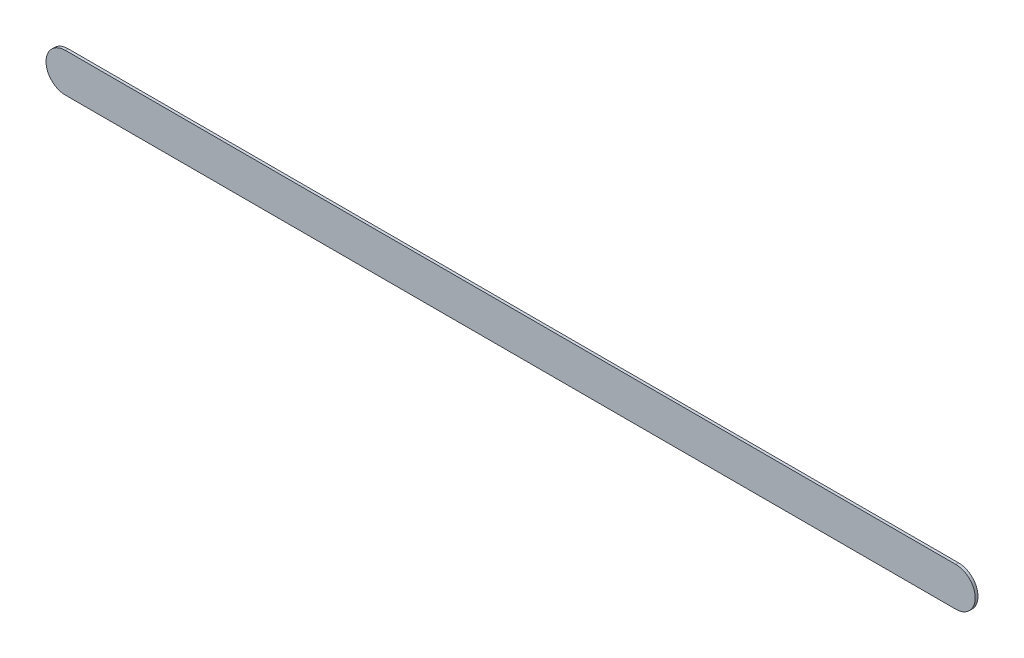
ISO-10303-21;
HEADER;
FILE_DESCRIPTION(('STEP AP214'),'2;1');
FILE_NAME('part.step','',(''),(''),'','','');
FILE_SCHEMA(('AUTOMOTIVE_DESIGN { 1 0 10303 214 1 1 1 1 }'));
ENDSEC;
DATA;
#1=APPLICATION_CONTEXT('core data for automotive mechanical design processes');
#2=APPLICATION_PROTOCOL_DEFINITION('international standard','automotive_design',2000,#1);
#3=PRODUCT_CONTEXT('',#1,'mechanical');
#4=PRODUCT('Part','Part','',(#3));
#5=PRODUCT_RELATED_PRODUCT_CATEGORY('part','',(#4));
#6=PRODUCT_DEFINITION_FORMATION('','',#4);
#7=PRODUCT_DEFINITION_CONTEXT('part definition',#1,'design');
#8=PRODUCT_DEFINITION('design','',#6,#7);
#9=PRODUCT_DEFINITION_SHAPE('','',#8);
#10=(LENGTH_UNIT() NAMED_UNIT(*) SI_UNIT(.MILLI.,.METRE.));
#11=(NAMED_UNIT(*) PLANE_ANGLE_UNIT() SI_UNIT($,.RADIAN.));
#12=(NAMED_UNIT(*) SI_UNIT($,.STERADIAN.) SOLID_ANGLE_UNIT());
#13=UNCERTAINTY_MEASURE_WITH_UNIT(LENGTH_MEASURE(1.E-05),#10,'distance_accuracy_value','');
#14=(GEOMETRIC_REPRESENTATION_CONTEXT(3) GLOBAL_UNCERTAINTY_ASSIGNED_CONTEXT((#13)) GLOBAL_UNIT_ASSIGNED_CONTEXT((#10,
#11,#12)) REPRESENTATION_CONTEXT('',''));
#15=CARTESIAN_POINT('',(0.,0.,0.));
#16=DIRECTION('',(0.,0.,1.));
#17=DIRECTION('',(1.,0.,0.));
#18=AXIS2_PLACEMENT_3D('',#15,#16,#17);
#19=CARTESIAN_POINT('',(78.2673695,113.24999956,0.));
#20=DIRECTION('',(0.,1.,0.));
#21=DIRECTION('',(1.,0.,0.));
#22=AXIS2_PLACEMENT_3D('',#19,#20,#21);
#23=PLANE('',#22);
#24=DIRECTION('',(1.,0.,0.));
#25=VECTOR('',#24,1.);
#26=CARTESIAN_POINT('',(78.2673695,113.24999956,0.03556));
#27=LINE('',#26,#25);
#28=CARTESIAN_POINT('',(78.2673695,113.24999956,0.03556));
#29=VERTEX_POINT('',#28);
#30=CARTESIAN_POINT('',(89.73901534,113.24999956,0.03556));
#31=VERTEX_POINT('',#30);
#32=EDGE_CURVE('E11',#29,#31,#27,.T.);
#33=ORIENTED_EDGE('',*,*,#32,.F.);
#34=DIRECTION('',(0.,0.,1.));
#35=VECTOR('',#34,1.);
#36=CARTESIAN_POINT('',(78.2673695,113.24999956,0.));
#37=LINE('',#36,#35);
#38=CARTESIAN_POINT('',(78.2673695,113.24999956,0.));
#39=VERTEX_POINT('',#38);
#40=EDGE_CURVE('E24',#39,#29,#37,.T.);
#41=ORIENTED_EDGE('',*,*,#40,.F.);
#42=DIRECTION('',(1.,0.,0.));
#43=VECTOR('',#42,1.);
#44=CARTESIAN_POINT('',(78.2673695,113.24999956,0.));
#45=LINE('',#44,#43);
#46=CARTESIAN_POINT('',(89.73901534,113.24999956,0.));
#47=VERTEX_POINT('',#46);
#48=EDGE_CURVE('E75',#39,#47,#45,.T.);
#49=ORIENTED_EDGE('',*,*,#48,.T.);
#50=DIRECTION('',(0.,0.,1.));
#51=VECTOR('',#50,1.);
#52=CARTESIAN_POINT('',(89.73901534,113.24999956,0.));
#53=LINE('',#52,#51);
#54=EDGE_CURVE('E37',#47,#31,#53,.T.);
#55=ORIENTED_EDGE('',*,*,#54,.T.);
#56=EDGE_LOOP('',(#33,#41,#49,#55));
#57=FACE_BOUND('',#56,.T.);
#58=ADVANCED_FACE('F17',(#57),#23,.F.);
#59=CARTESIAN_POINT('',(89.73901534,113.49999906,0.));
#60=DIRECTION('',(0.,0.,-1.));
#61=DIRECTION('',(0.,-1.,0.));
#62=AXIS2_PLACEMENT_3D('',#59,#60,#61);
#63=CYLINDRICAL_SURFACE('',#62,0.249999499999997);
#64=CARTESIAN_POINT('',(89.73901534,113.49999906,0.03556));
#65=DIRECTION('',(0.,0.,1.));
#66=DIRECTION('',(0.,-1.,0.));
#67=AXIS2_PLACEMENT_3D('',#64,#65,#66);
#68=CIRCLE('',#67,0.249999499999997);
#69=CARTESIAN_POINT('',(89.73901534,113.74999856,0.03556));
#70=VERTEX_POINT('',#69);
#71=EDGE_CURVE('E83',#31,#70,#68,.T.);
#72=ORIENTED_EDGE('',*,*,#71,.F.);
#73=ORIENTED_EDGE('',*,*,#54,.F.);
#74=CARTESIAN_POINT('',(89.73901534,113.49999906,0.));
#75=DIRECTION('',(0.,0.,1.));
#76=DIRECTION('',(0.,-1.,0.));
#77=AXIS2_PLACEMENT_3D('',#74,#75,#76);
#78=CIRCLE('',#77,0.249999499999997);
#79=CARTESIAN_POINT('',(89.73901534,113.74999856,0.));
#80=VERTEX_POINT('',#79);
#81=EDGE_CURVE('E81',#47,#80,#78,.T.);
#82=ORIENTED_EDGE('',*,*,#81,.T.);
#83=DIRECTION('',(0.,0.,1.));
#84=VECTOR('',#83,1.);
#85=CARTESIAN_POINT('',(89.73901534,113.74999856,0.));
#86=LINE('',#85,#84);
#87=EDGE_CURVE('E67',#80,#70,#86,.T.);
#88=ORIENTED_EDGE('',*,*,#87,.T.);
#89=EDGE_LOOP('',(#72,#73,#82,#88));
#90=FACE_BOUND('',#89,.T.);
#91=ADVANCED_FACE('F89',(#90),#63,.T.);
#92=CARTESIAN_POINT('',(89.73901534,113.74999856,0.));
#93=DIRECTION('',(0.,-1.,0.));
#94=DIRECTION('',(-1.,0.,0.));
#95=AXIS2_PLACEMENT_3D('',#92,#93,#94);
#96=PLANE('',#95);
#97=DIRECTION('',(-1.,0.,0.));
#98=VECTOR('',#97,1.);
#99=CARTESIAN_POINT('',(89.73901534,113.74999856,0.03556));
#100=LINE('',#99,#98);
#101=CARTESIAN_POINT('',(78.2673695,113.74999856,0.03556));
#102=VERTEX_POINT('',#101);
#103=EDGE_CURVE('E71',#70,#102,#100,.T.);
#104=ORIENTED_EDGE('',*,*,#103,.F.);
#105=ORIENTED_EDGE('',*,*,#87,.F.);
#106=DIRECTION('',(-1.,0.,0.));
#107=VECTOR('',#106,1.);
#108=CARTESIAN_POINT('',(89.73901534,113.74999856,0.));
#109=LINE('',#108,#107);
#110=CARTESIAN_POINT('',(78.2673695,113.74999856,0.));
#111=VERTEX_POINT('',#110);
#112=EDGE_CURVE('E63',#80,#111,#109,.T.);
#113=ORIENTED_EDGE('',*,*,#112,.T.);
#114=DIRECTION('',(0.,0.,1.));
#115=VECTOR('',#114,1.);
#116=CARTESIAN_POINT('',(78.2673695,113.74999856,0.));
#117=LINE('',#116,#115);
#118=EDGE_CURVE('E53',#111,#102,#117,.T.);
#119=ORIENTED_EDGE('',*,*,#118,.T.);
#120=EDGE_LOOP('',(#104,#105,#113,#119));
#121=FACE_BOUND('',#120,.T.);
#122=ADVANCED_FACE('F66',(#121),#96,.F.);
#123=CARTESIAN_POINT('',(78.2673695,113.49999906,0.));
#124=DIRECTION('',(0.,0.,-1.));
#125=DIRECTION('',(0.,1.,0.));
#126=AXIS2_PLACEMENT_3D('',#123,#124,#125);
#127=CYLINDRICAL_SURFACE('',#126,0.249999499999997);
#128=CARTESIAN_POINT('',(78.2673695,113.49999906,0.03556));
#129=DIRECTION('',(0.,0.,1.));
#130=DIRECTION('',(0.,1.,0.));
#131=AXIS2_PLACEMENT_3D('',#128,#129,#130);
#132=CIRCLE('',#131,0.249999499999997);
#133=EDGE_CURVE('E59',#102,#29,#132,.T.);
#134=ORIENTED_EDGE('',*,*,#133,.F.);
#135=ORIENTED_EDGE('',*,*,#118,.F.);
#136=CARTESIAN_POINT('',(78.2673695,113.49999906,0.));
#137=DIRECTION('',(0.,0.,1.));
#138=DIRECTION('',(0.,1.,0.));
#139=AXIS2_PLACEMENT_3D('',#136,#137,#138);
#140=CIRCLE('',#139,0.249999499999997);
#141=EDGE_CURVE('E57',#111,#39,#140,.T.);
#142=ORIENTED_EDGE('',*,*,#141,.T.);
#143=ORIENTED_EDGE('',*,*,#40,.T.);
#144=EDGE_LOOP('',(#134,#135,#142,#143));
#145=FACE_BOUND('',#144,.T.);
#146=ADVANCED_FACE('F55',(#145),#127,.T.);
#147=CARTESIAN_POINT('',(78.2673695,113.24999956,0.));
#148=DIRECTION('',(0.,0.,-1.));
#149=DIRECTION('',(-1.,0.,0.));
#150=AXIS2_PLACEMENT_3D('',#147,#148,#149);
#151=PLANE('',#150);
#152=ORIENTED_EDGE('',*,*,#141,.F.);
#153=ORIENTED_EDGE('',*,*,#112,.F.);
#154=ORIENTED_EDGE('',*,*,#81,.F.);
#155=ORIENTED_EDGE('',*,*,#48,.F.);
#156=EDGE_LOOP('',(#152,#153,#154,#155));
#157=FACE_BOUND('',#156,.T.);
#158=ADVANCED_FACE('F74',(#157),#151,.T.);
#159=CARTESIAN_POINT('',(78.2673695,113.24999956,0.03556));
#160=DIRECTION('',(0.,0.,-1.));
#161=DIRECTION('',(-1.,0.,0.));
#162=AXIS2_PLACEMENT_3D('',#159,#160,#161);
#163=PLANE('',#162);
#164=ORIENTED_EDGE('',*,*,#32,.T.);
#165=ORIENTED_EDGE('',*,*,#71,.T.);
#166=ORIENTED_EDGE('',*,*,#103,.T.);
#167=ORIENTED_EDGE('',*,*,#133,.T.);
#168=EDGE_LOOP('',(#164,#165,#166,#167));
#169=FACE_BOUND('',#168,.T.);
#170=ADVANCED_FACE('F91',(#169),#163,.F.);
#171=CLOSED_SHELL('',(#58,#91,#122,#146,#158,#170));
#172=MANIFOLD_SOLID_BREP('B1',#171);
#173=ADVANCED_BREP_SHAPE_REPRESENTATION('',(#18,#172),#14);
#174=SHAPE_DEFINITION_REPRESENTATION(#9,#173);
ENDSEC;
END-ISO-10303-21;
